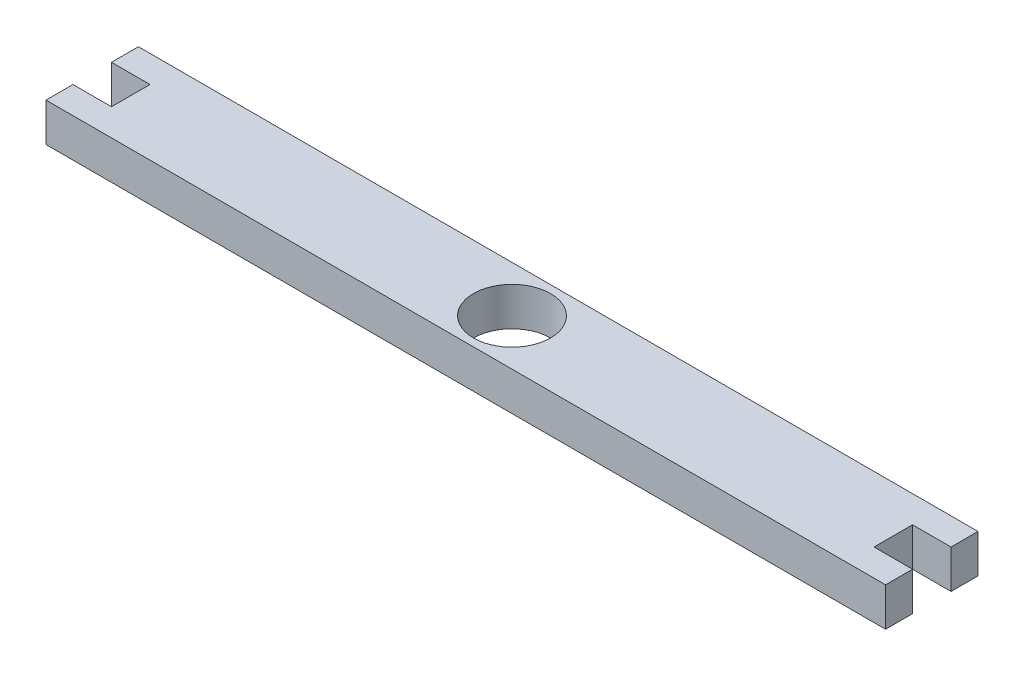
ISO-10303-21;
HEADER;
FILE_DESCRIPTION(('STEP AP214'),'2;1');
FILE_NAME('part.step','',(''),(''),'','','');
FILE_SCHEMA(('AUTOMOTIVE_DESIGN { 1 0 10303 214 1 1 1 1 }'));
ENDSEC;
DATA;
#1=APPLICATION_CONTEXT('core data for automotive mechanical design processes');
#2=APPLICATION_PROTOCOL_DEFINITION('international standard','automotive_design',2000,#1);
#3=PRODUCT_CONTEXT('',#1,'mechanical');
#4=PRODUCT('Part','Part','',(#3));
#5=PRODUCT_RELATED_PRODUCT_CATEGORY('part','',(#4));
#6=PRODUCT_DEFINITION_FORMATION('','',#4);
#7=PRODUCT_DEFINITION_CONTEXT('part definition',#1,'design');
#8=PRODUCT_DEFINITION('design','',#6,#7);
#9=PRODUCT_DEFINITION_SHAPE('','',#8);
#10=(LENGTH_UNIT() NAMED_UNIT(*) SI_UNIT(.MILLI.,.METRE.));
#11=(NAMED_UNIT(*) PLANE_ANGLE_UNIT() SI_UNIT($,.RADIAN.));
#12=(NAMED_UNIT(*) SI_UNIT($,.STERADIAN.) SOLID_ANGLE_UNIT());
#13=UNCERTAINTY_MEASURE_WITH_UNIT(LENGTH_MEASURE(1.E-05),#10,'distance_accuracy_value','');
#14=(GEOMETRIC_REPRESENTATION_CONTEXT(3) GLOBAL_UNCERTAINTY_ASSIGNED_CONTEXT((#13)) GLOBAL_UNIT_ASSIGNED_CONTEXT((#10,
#11,#12)) REPRESENTATION_CONTEXT('',''));
#15=CARTESIAN_POINT('',(0.,0.,0.));
#16=DIRECTION('',(0.,0.,1.));
#17=DIRECTION('',(1.,0.,0.));
#18=AXIS2_PLACEMENT_3D('',#15,#16,#17);
#19=CARTESIAN_POINT('',(54.5,5.,-6.));
#20=DIRECTION('',(-1.,0.,0.));
#21=DIRECTION('',(0.,0.,1.));
#22=AXIS2_PLACEMENT_3D('',#19,#20,#21);
#23=PLANE('',#22);
#24=DIRECTION('',(0.,1.,0.));
#25=VECTOR('',#24,1.);
#26=CARTESIAN_POINT('',(54.5,0.,2.5));
#27=LINE('',#26,#25);
#28=CARTESIAN_POINT('',(54.5,0.,2.5));
#29=VERTEX_POINT('',#28);
#30=CARTESIAN_POINT('',(54.5,5.,2.5));
#31=VERTEX_POINT('',#30);
#32=EDGE_CURVE('E196',#29,#31,#27,.T.);
#33=ORIENTED_EDGE('',*,*,#32,.T.);
#34=DIRECTION('',(0.,0.,-1.));
#35=VECTOR('',#34,1.);
#36=CARTESIAN_POINT('',(54.5,5.,-6.));
#37=LINE('',#36,#35);
#38=CARTESIAN_POINT('',(54.5,5.,6.));
#39=VERTEX_POINT('',#38);
#40=EDGE_CURVE('E208',#39,#31,#37,.T.);
#41=ORIENTED_EDGE('',*,*,#40,.F.);
#42=DIRECTION('',(0.,-1.,0.));
#43=VECTOR('',#42,1.);
#44=CARTESIAN_POINT('',(54.5,5.,6.));
#45=LINE('',#44,#43);
#46=CARTESIAN_POINT('',(54.5,0.,6.));
#47=VERTEX_POINT('',#46);
#48=EDGE_CURVE('E164',#39,#47,#45,.T.);
#49=ORIENTED_EDGE('',*,*,#48,.T.);
#50=DIRECTION('',(0.,0.,-1.));
#51=VECTOR('',#50,1.);
#52=CARTESIAN_POINT('',(54.5,0.,-6.));
#53=LINE('',#52,#51);
#54=EDGE_CURVE('E146',#47,#29,#53,.T.);
#55=ORIENTED_EDGE('',*,*,#54,.T.);
#56=EDGE_LOOP('',(#33,#41,#49,#55));
#57=FACE_BOUND('',#56,.T.);
#58=ADVANCED_FACE('F36',(#57),#23,.F.);
#59=DIRECTION('',(0.,1.,0.));
#60=VECTOR('',#59,1.);
#61=CARTESIAN_POINT('',(54.5,0.,-2.5));
#62=LINE('',#61,#60);
#63=CARTESIAN_POINT('',(54.5,0.,-2.5));
#64=VERTEX_POINT('',#63);
#65=CARTESIAN_POINT('',(54.5,5.,-2.5));
#66=VERTEX_POINT('',#65);
#67=EDGE_CURVE('E125',#64,#66,#62,.T.);
#68=ORIENTED_EDGE('',*,*,#67,.F.);
#69=CARTESIAN_POINT('',(54.5,0.,-6.));
#70=VERTEX_POINT('',#69);
#71=EDGE_CURVE('E137',#64,#70,#53,.T.);
#72=ORIENTED_EDGE('',*,*,#71,.T.);
#73=DIRECTION('',(0.,-1.,0.));
#74=VECTOR('',#73,1.);
#75=CARTESIAN_POINT('',(54.5,5.,-6.));
#76=LINE('',#75,#74);
#77=CARTESIAN_POINT('',(54.5,5.,-6.));
#78=VERTEX_POINT('',#77);
#79=EDGE_CURVE('E11',#78,#70,#76,.T.);
#80=ORIENTED_EDGE('',*,*,#79,.F.);
#81=EDGE_CURVE('E139',#66,#78,#37,.T.);
#82=ORIENTED_EDGE('',*,*,#81,.F.);
#83=EDGE_LOOP('',(#68,#72,#80,#82));
#84=FACE_BOUND('',#83,.T.);
#85=ADVANCED_FACE('F135',(#84),#23,.F.);
#86=CARTESIAN_POINT('',(0.,5.,0.));
#87=DIRECTION('',(0.,1.,0.));
#88=DIRECTION('',(0.,0.,1.));
#89=AXIS2_PLACEMENT_3D('',#86,#87,#88);
#90=PLANE('',#89);
#91=CARTESIAN_POINT('',(0.,5.,0.));
#92=DIRECTION('',(0.,1.,0.));
#93=DIRECTION('',(0.,0.,1.));
#94=AXIS2_PLACEMENT_3D('',#91,#92,#93);
#95=CIRCLE('',#94,5.);
#96=CARTESIAN_POINT('',(0.,5.,5.));
#97=VERTEX_POINT('',#96);
#98=EDGE_CURVE('E151',#97,#97,#95,.T.);
#99=ORIENTED_EDGE('',*,*,#98,.F.);
#100=EDGE_LOOP('',(#99));
#101=FACE_BOUND('',#100,.T.);
#102=ORIENTED_EDGE('',*,*,#40,.T.);
#103=DIRECTION('',(-1.,0.,0.));
#104=VECTOR('',#103,1.);
#105=CARTESIAN_POINT('',(49.5,5.,2.5));
#106=LINE('',#105,#104);
#107=CARTESIAN_POINT('',(49.5,5.,2.5));
#108=VERTEX_POINT('',#107);
#109=EDGE_CURVE('E131',#31,#108,#106,.T.);
#110=ORIENTED_EDGE('',*,*,#109,.T.);
#111=DIRECTION('',(0.,0.,-1.));
#112=VECTOR('',#111,1.);
#113=CARTESIAN_POINT('',(49.5,5.,-2.5));
#114=LINE('',#113,#112);
#115=CARTESIAN_POINT('',(49.5,5.,-2.5));
#116=VERTEX_POINT('',#115);
#117=EDGE_CURVE('E236',#108,#116,#114,.T.);
#118=ORIENTED_EDGE('',*,*,#117,.T.);
#119=DIRECTION('',(1.,0.,0.));
#120=VECTOR('',#119,1.);
#121=CARTESIAN_POINT('',(54.5,5.,-2.5));
#122=LINE('',#121,#120);
#123=EDGE_CURVE('E239',#116,#66,#122,.T.);
#124=ORIENTED_EDGE('',*,*,#123,.T.);
#125=ORIENTED_EDGE('',*,*,#81,.T.);
#126=DIRECTION('',(-1.,0.,0.));
#127=VECTOR('',#126,1.);
#128=CARTESIAN_POINT('',(-54.5,5.,-6.));
#129=LINE('',#128,#127);
#130=CARTESIAN_POINT('',(-54.5,5.,-6.));
#131=VERTEX_POINT('',#130);
#132=EDGE_CURVE('E211',#78,#131,#129,.T.);
#133=ORIENTED_EDGE('',*,*,#132,.T.);
#134=DIRECTION('',(0.,0.,1.));
#135=VECTOR('',#134,1.);
#136=CARTESIAN_POINT('',(-54.5,5.,-6.));
#137=LINE('',#136,#135);
#138=CARTESIAN_POINT('',(-54.5,5.,-2.5));
#139=VERTEX_POINT('',#138);
#140=EDGE_CURVE('E176',#131,#139,#137,.T.);
#141=ORIENTED_EDGE('',*,*,#140,.T.);
#142=DIRECTION('',(-1.,0.,0.));
#143=VECTOR('',#142,1.);
#144=CARTESIAN_POINT('',(-54.5,5.,-2.5));
#145=LINE('',#144,#143);
#146=CARTESIAN_POINT('',(-49.5,5.,-2.5));
#147=VERTEX_POINT('',#146);
#148=EDGE_CURVE('E199',#147,#139,#145,.T.);
#149=ORIENTED_EDGE('',*,*,#148,.F.);
#150=DIRECTION('',(0.,0.,-1.));
#151=VECTOR('',#150,1.);
#152=CARTESIAN_POINT('',(-49.5,5.,-2.5));
#153=LINE('',#152,#151);
#154=CARTESIAN_POINT('',(-49.5,5.,2.5));
#155=VERTEX_POINT('',#154);
#156=EDGE_CURVE('E195',#155,#147,#153,.T.);
#157=ORIENTED_EDGE('',*,*,#156,.F.);
#158=DIRECTION('',(1.,0.,0.));
#159=VECTOR('',#158,1.);
#160=CARTESIAN_POINT('',(-49.5,5.,2.5));
#161=LINE('',#160,#159);
#162=CARTESIAN_POINT('',(-54.5,5.,2.5));
#163=VERTEX_POINT('',#162);
#164=EDGE_CURVE('E192',#163,#155,#161,.T.);
#165=ORIENTED_EDGE('',*,*,#164,.F.);
#166=CARTESIAN_POINT('',(-54.5,5.,6.));
#167=VERTEX_POINT('',#166);
#168=EDGE_CURVE('E212',#163,#167,#137,.T.);
#169=ORIENTED_EDGE('',*,*,#168,.T.);
#170=DIRECTION('',(1.,0.,0.));
#171=VECTOR('',#170,1.);
#172=CARTESIAN_POINT('',(-54.5,5.,6.));
#173=LINE('',#172,#171);
#174=EDGE_CURVE('E155',#167,#39,#173,.T.);
#175=ORIENTED_EDGE('',*,*,#174,.T.);
#176=EDGE_LOOP('',(#102,#110,#118,#124,#125,#133,#141,#149,#157,#165,#169,#175));
#177=FACE_BOUND('',#176,.T.);
#178=ADVANCED_FACE('F218',(#101,#177),#90,.T.);
#179=CARTESIAN_POINT('',(0.,0.,0.));
#180=DIRECTION('',(0.,1.,0.));
#181=DIRECTION('',(0.,0.,1.));
#182=AXIS2_PLACEMENT_3D('',#179,#180,#181);
#183=PLANE('',#182);
#184=CARTESIAN_POINT('',(0.,0.,0.));
#185=DIRECTION('',(0.,1.,0.));
#186=DIRECTION('',(0.,0.,1.));
#187=AXIS2_PLACEMENT_3D('',#184,#185,#186);
#188=CIRCLE('',#187,5.);
#189=CARTESIAN_POINT('',(0.,0.,5.));
#190=VERTEX_POINT('',#189);
#191=EDGE_CURVE('E147',#190,#190,#188,.T.);
#192=ORIENTED_EDGE('',*,*,#191,.T.);
#193=EDGE_LOOP('',(#192));
#194=FACE_BOUND('',#193,.T.);
#195=DIRECTION('',(-1.,0.,0.));
#196=VECTOR('',#195,1.);
#197=CARTESIAN_POINT('',(49.5,0.,2.5));
#198=LINE('',#197,#196);
#199=CARTESIAN_POINT('',(49.5,0.,2.5));
#200=VERTEX_POINT('',#199);
#201=EDGE_CURVE('E140',#29,#200,#198,.T.);
#202=ORIENTED_EDGE('',*,*,#201,.F.);
#203=ORIENTED_EDGE('',*,*,#54,.F.);
#204=DIRECTION('',(1.,0.,0.));
#205=VECTOR('',#204,1.);
#206=CARTESIAN_POINT('',(-54.5,0.,6.));
#207=LINE('',#206,#205);
#208=CARTESIAN_POINT('',(-54.5,0.,6.));
#209=VERTEX_POINT('',#208);
#210=EDGE_CURVE('E162',#209,#47,#207,.T.);
#211=ORIENTED_EDGE('',*,*,#210,.F.);
#212=DIRECTION('',(0.,0.,1.));
#213=VECTOR('',#212,1.);
#214=CARTESIAN_POINT('',(-54.5,0.,-6.));
#215=LINE('',#214,#213);
#216=CARTESIAN_POINT('',(-54.5,0.,2.5));
#217=VERTEX_POINT('',#216);
#218=EDGE_CURVE('E158',#217,#209,#215,.T.);
#219=ORIENTED_EDGE('',*,*,#218,.F.);
#220=DIRECTION('',(1.,0.,0.));
#221=VECTOR('',#220,1.);
#222=CARTESIAN_POINT('',(-49.5,0.,2.5));
#223=LINE('',#222,#221);
#224=CARTESIAN_POINT('',(-49.5,0.,2.5));
#225=VERTEX_POINT('',#224);
#226=EDGE_CURVE('E188',#217,#225,#223,.T.);
#227=ORIENTED_EDGE('',*,*,#226,.T.);
#228=DIRECTION('',(0.,0.,-1.));
#229=VECTOR('',#228,1.);
#230=CARTESIAN_POINT('',(-49.5,0.,-2.5));
#231=LINE('',#230,#229);
#232=CARTESIAN_POINT('',(-49.5,0.,-2.5));
#233=VERTEX_POINT('',#232);
#234=EDGE_CURVE('E58',#225,#233,#231,.T.);
#235=ORIENTED_EDGE('',*,*,#234,.T.);
#236=DIRECTION('',(-1.,0.,0.));
#237=VECTOR('',#236,1.);
#238=CARTESIAN_POINT('',(-54.5,0.,-2.5));
#239=LINE('',#238,#237);
#240=CARTESIAN_POINT('',(-54.5,0.,-2.5));
#241=VERTEX_POINT('',#240);
#242=EDGE_CURVE('E181',#233,#241,#239,.T.);
#243=ORIENTED_EDGE('',*,*,#242,.T.);
#244=CARTESIAN_POINT('',(-54.5,0.,-6.));
#245=VERTEX_POINT('',#244);
#246=EDGE_CURVE('E159',#245,#241,#215,.T.);
#247=ORIENTED_EDGE('',*,*,#246,.F.);
#248=DIRECTION('',(-1.,0.,0.));
#249=VECTOR('',#248,1.);
#250=CARTESIAN_POINT('',(-54.5,0.,-6.));
#251=LINE('',#250,#249);
#252=EDGE_CURVE('E145',#70,#245,#251,.T.);
#253=ORIENTED_EDGE('',*,*,#252,.F.);
#254=ORIENTED_EDGE('',*,*,#71,.F.);
#255=DIRECTION('',(1.,0.,0.));
#256=VECTOR('',#255,1.);
#257=CARTESIAN_POINT('',(54.5,0.,-2.5));
#258=LINE('',#257,#256);
#259=CARTESIAN_POINT('',(49.5,0.,-2.5));
#260=VERTEX_POINT('',#259);
#261=EDGE_CURVE('E122',#260,#64,#258,.T.);
#262=ORIENTED_EDGE('',*,*,#261,.F.);
#263=DIRECTION('',(0.,0.,-1.));
#264=VECTOR('',#263,1.);
#265=CARTESIAN_POINT('',(49.5,0.,-2.5));
#266=LINE('',#265,#264);
#267=EDGE_CURVE('E130',#200,#260,#266,.T.);
#268=ORIENTED_EDGE('',*,*,#267,.F.);
#269=EDGE_LOOP('',(#202,#203,#211,#219,#227,#235,#243,#247,#253,#254,#262,#268));
#270=FACE_BOUND('',#269,.T.);
#271=ADVANCED_FACE('F143',(#194,#270),#183,.F.);
#272=CARTESIAN_POINT('',(-54.5,5.,-6.));
#273=DIRECTION('',(1.,0.,0.));
#274=DIRECTION('',(0.,0.,-1.));
#275=AXIS2_PLACEMENT_3D('',#272,#273,#274);
#276=PLANE('',#275);
#277=ORIENTED_EDGE('',*,*,#246,.T.);
#278=DIRECTION('',(0.,1.,0.));
#279=VECTOR('',#278,1.);
#280=CARTESIAN_POINT('',(-54.5,0.,-2.5));
#281=LINE('',#280,#279);
#282=EDGE_CURVE('E201',#241,#139,#281,.T.);
#283=ORIENTED_EDGE('',*,*,#282,.T.);
#284=ORIENTED_EDGE('',*,*,#140,.F.);
#285=DIRECTION('',(0.,-1.,0.));
#286=VECTOR('',#285,1.);
#287=CARTESIAN_POINT('',(-54.5,5.,-6.));
#288=LINE('',#287,#286);
#289=EDGE_CURVE('E43',#131,#245,#288,.T.);
#290=ORIENTED_EDGE('',*,*,#289,.T.);
#291=EDGE_LOOP('',(#277,#283,#284,#290));
#292=FACE_BOUND('',#291,.T.);
#293=ADVANCED_FACE('F173',(#292),#276,.F.);
#294=CARTESIAN_POINT('',(-54.5,5.,-6.));
#295=DIRECTION('',(0.,0.,1.));
#296=DIRECTION('',(1.,0.,0.));
#297=AXIS2_PLACEMENT_3D('',#294,#295,#296);
#298=PLANE('',#297);
#299=ORIENTED_EDGE('',*,*,#252,.T.);
#300=ORIENTED_EDGE('',*,*,#289,.F.);
#301=ORIENTED_EDGE('',*,*,#132,.F.);
#302=ORIENTED_EDGE('',*,*,#79,.T.);
#303=EDGE_LOOP('',(#299,#300,#301,#302));
#304=FACE_BOUND('',#303,.T.);
#305=ADVANCED_FACE('F281',(#304),#298,.F.);
#306=ORIENTED_EDGE('',*,*,#168,.F.);
#307=DIRECTION('',(0.,1.,0.));
#308=VECTOR('',#307,1.);
#309=CARTESIAN_POINT('',(-54.5,0.,2.5));
#310=LINE('',#309,#308);
#311=EDGE_CURVE('E184',#217,#163,#310,.T.);
#312=ORIENTED_EDGE('',*,*,#311,.F.);
#313=ORIENTED_EDGE('',*,*,#218,.T.);
#314=DIRECTION('',(0.,-1.,0.));
#315=VECTOR('',#314,1.);
#316=CARTESIAN_POINT('',(-54.5,5.,6.));
#317=LINE('',#316,#315);
#318=EDGE_CURVE('E167',#167,#209,#317,.T.);
#319=ORIENTED_EDGE('',*,*,#318,.F.);
#320=EDGE_LOOP('',(#306,#312,#313,#319));
#321=FACE_BOUND('',#320,.T.);
#322=ADVANCED_FACE('F224',(#321),#276,.F.);
#323=CARTESIAN_POINT('',(-54.5,5.,6.));
#324=DIRECTION('',(0.,0.,-1.));
#325=DIRECTION('',(-1.,0.,0.));
#326=AXIS2_PLACEMENT_3D('',#323,#324,#325);
#327=PLANE('',#326);
#328=ORIENTED_EDGE('',*,*,#210,.T.);
#329=ORIENTED_EDGE('',*,*,#48,.F.);
#330=ORIENTED_EDGE('',*,*,#174,.F.);
#331=ORIENTED_EDGE('',*,*,#318,.T.);
#332=EDGE_LOOP('',(#328,#329,#330,#331));
#333=FACE_BOUND('',#332,.T.);
#334=ADVANCED_FACE('F228',(#333),#327,.F.);
#335=CARTESIAN_POINT('',(0.,0.,0.));
#336=DIRECTION('',(0.,1.,0.));
#337=DIRECTION('',(0.,0.,1.));
#338=AXIS2_PLACEMENT_3D('',#335,#336,#337);
#339=CYLINDRICAL_SURFACE('',#338,5.);
#340=ORIENTED_EDGE('',*,*,#191,.F.);
#341=EDGE_LOOP('',(#340));
#342=FACE_BOUND('',#341,.T.);
#343=ORIENTED_EDGE('',*,*,#98,.T.);
#344=EDGE_LOOP('',(#343));
#345=FACE_BOUND('',#344,.T.);
#346=ADVANCED_FACE('F251',(#342,#345),#339,.F.);
#347=CARTESIAN_POINT('',(-54.5,0.,-2.5));
#348=DIRECTION('',(0.,0.,-1.));
#349=DIRECTION('',(-1.,0.,0.));
#350=AXIS2_PLACEMENT_3D('',#347,#348,#349);
#351=PLANE('',#350);
#352=ORIENTED_EDGE('',*,*,#148,.T.);
#353=ORIENTED_EDGE('',*,*,#282,.F.);
#354=ORIENTED_EDGE('',*,*,#242,.F.);
#355=DIRECTION('',(0.,1.,0.));
#356=VECTOR('',#355,1.);
#357=CARTESIAN_POINT('',(-49.5,0.,-2.5));
#358=LINE('',#357,#356);
#359=EDGE_CURVE('E203',#233,#147,#358,.T.);
#360=ORIENTED_EDGE('',*,*,#359,.T.);
#361=EDGE_LOOP('',(#352,#353,#354,#360));
#362=FACE_BOUND('',#361,.T.);
#363=ADVANCED_FACE('F249',(#362),#351,.F.);
#364=CARTESIAN_POINT('',(-49.5,0.,-2.5));
#365=DIRECTION('',(1.,0.,0.));
#366=DIRECTION('',(0.,0.,-1.));
#367=AXIS2_PLACEMENT_3D('',#364,#365,#366);
#368=PLANE('',#367);
#369=ORIENTED_EDGE('',*,*,#156,.T.);
#370=ORIENTED_EDGE('',*,*,#359,.F.);
#371=ORIENTED_EDGE('',*,*,#234,.F.);
#372=DIRECTION('',(0.,1.,0.));
#373=VECTOR('',#372,1.);
#374=CARTESIAN_POINT('',(-49.5,0.,2.5));
#375=LINE('',#374,#373);
#376=EDGE_CURVE('E186',#225,#155,#375,.T.);
#377=ORIENTED_EDGE('',*,*,#376,.T.);
#378=EDGE_LOOP('',(#369,#370,#371,#377));
#379=FACE_BOUND('',#378,.T.);
#380=ADVANCED_FACE('F248',(#379),#368,.F.);
#381=CARTESIAN_POINT('',(-49.5,0.,2.5));
#382=DIRECTION('',(0.,0.,1.));
#383=DIRECTION('',(1.,0.,0.));
#384=AXIS2_PLACEMENT_3D('',#381,#382,#383);
#385=PLANE('',#384);
#386=ORIENTED_EDGE('',*,*,#164,.T.);
#387=ORIENTED_EDGE('',*,*,#376,.F.);
#388=ORIENTED_EDGE('',*,*,#226,.F.);
#389=ORIENTED_EDGE('',*,*,#311,.T.);
#390=EDGE_LOOP('',(#386,#387,#388,#389));
#391=FACE_BOUND('',#390,.T.);
#392=ADVANCED_FACE('F247',(#391),#385,.F.);
#393=CARTESIAN_POINT('',(49.5,0.,2.5));
#394=DIRECTION('',(0.,0.,-1.));
#395=DIRECTION('',(-1.,0.,0.));
#396=AXIS2_PLACEMENT_3D('',#393,#394,#395);
#397=PLANE('',#396);
#398=ORIENTED_EDGE('',*,*,#109,.F.);
#399=ORIENTED_EDGE('',*,*,#32,.F.);
#400=ORIENTED_EDGE('',*,*,#201,.T.);
#401=DIRECTION('',(0.,1.,0.));
#402=VECTOR('',#401,1.);
#403=CARTESIAN_POINT('',(49.5,0.,2.5));
#404=LINE('',#403,#402);
#405=EDGE_CURVE('E244',#200,#108,#404,.T.);
#406=ORIENTED_EDGE('',*,*,#405,.T.);
#407=EDGE_LOOP('',(#398,#399,#400,#406));
#408=FACE_BOUND('',#407,.T.);
#409=ADVANCED_FACE('F291',(#408),#397,.T.);
#410=CARTESIAN_POINT('',(49.5,0.,-2.5));
#411=DIRECTION('',(1.,0.,0.));
#412=DIRECTION('',(0.,0.,-1.));
#413=AXIS2_PLACEMENT_3D('',#410,#411,#412);
#414=PLANE('',#413);
#415=ORIENTED_EDGE('',*,*,#117,.F.);
#416=ORIENTED_EDGE('',*,*,#405,.F.);
#417=ORIENTED_EDGE('',*,*,#267,.T.);
#418=DIRECTION('',(0.,1.,0.));
#419=VECTOR('',#418,1.);
#420=CARTESIAN_POINT('',(49.5,0.,-2.5));
#421=LINE('',#420,#419);
#422=EDGE_CURVE('E50',#260,#116,#421,.T.);
#423=ORIENTED_EDGE('',*,*,#422,.T.);
#424=EDGE_LOOP('',(#415,#416,#417,#423));
#425=FACE_BOUND('',#424,.T.);
#426=ADVANCED_FACE('F290',(#425),#414,.T.);
#427=CARTESIAN_POINT('',(54.5,0.,-2.5));
#428=DIRECTION('',(0.,0.,1.));
#429=DIRECTION('',(1.,0.,0.));
#430=AXIS2_PLACEMENT_3D('',#427,#428,#429);
#431=PLANE('',#430);
#432=ORIENTED_EDGE('',*,*,#123,.F.);
#433=ORIENTED_EDGE('',*,*,#422,.F.);
#434=ORIENTED_EDGE('',*,*,#261,.T.);
#435=ORIENTED_EDGE('',*,*,#67,.T.);
#436=EDGE_LOOP('',(#432,#433,#434,#435));
#437=FACE_BOUND('',#436,.T.);
#438=ADVANCED_FACE('F124',(#437),#431,.T.);
#439=CLOSED_SHELL('',(#58,#85,#178,#271,#293,#305,#322,#334,#346,#363,#380,#392,#409,#426,#438));
#440=MANIFOLD_SOLID_BREP('B2',#439);
#441=ADVANCED_BREP_SHAPE_REPRESENTATION('',(#18,#440),#14);
#442=SHAPE_DEFINITION_REPRESENTATION(#9,#441);
ENDSEC;
END-ISO-10303-21;
